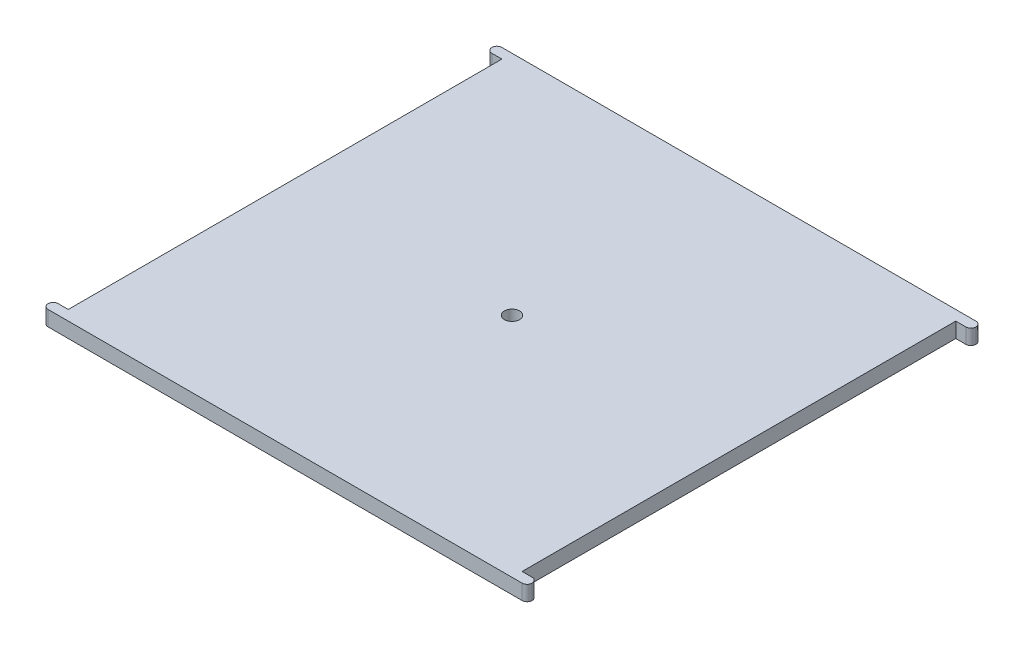
ISO-10303-21;
HEADER;
FILE_DESCRIPTION(('STEP AP214'),'2;1');
FILE_NAME('part.step','',(''),(''),'','','');
FILE_SCHEMA(('AUTOMOTIVE_DESIGN { 1 0 10303 214 1 1 1 1 }'));
ENDSEC;
DATA;
#1=APPLICATION_CONTEXT('core data for automotive mechanical design processes');
#2=APPLICATION_PROTOCOL_DEFINITION('international standard','automotive_design',2000,#1);
#3=PRODUCT_CONTEXT('',#1,'mechanical');
#4=PRODUCT('Part','Part','',(#3));
#5=PRODUCT_RELATED_PRODUCT_CATEGORY('part','',(#4));
#6=PRODUCT_DEFINITION_FORMATION('','',#4);
#7=PRODUCT_DEFINITION_CONTEXT('part definition',#1,'design');
#8=PRODUCT_DEFINITION('design','',#6,#7);
#9=PRODUCT_DEFINITION_SHAPE('','',#8);
#10=(LENGTH_UNIT() NAMED_UNIT(*) SI_UNIT(.MILLI.,.METRE.));
#11=(NAMED_UNIT(*) PLANE_ANGLE_UNIT() SI_UNIT($,.RADIAN.));
#12=(NAMED_UNIT(*) SI_UNIT($,.STERADIAN.) SOLID_ANGLE_UNIT());
#13=UNCERTAINTY_MEASURE_WITH_UNIT(LENGTH_MEASURE(1.E-05),#10,'distance_accuracy_value','');
#14=(GEOMETRIC_REPRESENTATION_CONTEXT(3) GLOBAL_UNCERTAINTY_ASSIGNED_CONTEXT((#13)) GLOBAL_UNIT_ASSIGNED_CONTEXT((#10,
#11,#12)) REPRESENTATION_CONTEXT('',''));
#15=CARTESIAN_POINT('',(0.,0.,0.));
#16=DIRECTION('',(0.,0.,1.));
#17=DIRECTION('',(1.,0.,0.));
#18=AXIS2_PLACEMENT_3D('',#15,#16,#17);
#19=CARTESIAN_POINT('',(-71.4375,4.7625,-71.4375));
#20=DIRECTION('',(0.,0.,1.));
#21=DIRECTION('',(1.,0.,0.));
#22=AXIS2_PLACEMENT_3D('',#19,#20,#21);
#23=PLANE('',#22);
#24=DIRECTION('',(-1.,0.,0.));
#25=VECTOR('',#24,1.);
#26=CARTESIAN_POINT('',(71.4375,4.7625,-71.4375));
#27=LINE('',#26,#25);
#28=CARTESIAN_POINT('',(74.6125,4.7625,-71.4375));
#29=VERTEX_POINT('',#28);
#30=CARTESIAN_POINT('',(-74.6125,4.7625,-71.4375));
#31=VERTEX_POINT('',#30);
#32=EDGE_CURVE('E157',#29,#31,#27,.T.);
#33=ORIENTED_EDGE('',*,*,#32,.F.);
#34=DIRECTION('',(0.,-1.,0.));
#35=VECTOR('',#34,1.);
#36=CARTESIAN_POINT('',(74.6125,4.7625,-71.4375));
#37=LINE('',#36,#35);
#38=CARTESIAN_POINT('',(74.6125,0.,-71.4375));
#39=VERTEX_POINT('',#38);
#40=EDGE_CURVE('E42',#29,#39,#37,.T.);
#41=ORIENTED_EDGE('',*,*,#40,.T.);
#42=DIRECTION('',(-1.,0.,0.));
#43=VECTOR('',#42,1.);
#44=CARTESIAN_POINT('',(-71.4375,0.,-71.4375));
#45=LINE('',#44,#43);
#46=CARTESIAN_POINT('',(-74.6125,0.,-71.4375));
#47=VERTEX_POINT('',#46);
#48=EDGE_CURVE('E187',#39,#47,#45,.T.);
#49=ORIENTED_EDGE('',*,*,#48,.T.);
#50=DIRECTION('',(0.,-1.,0.));
#51=VECTOR('',#50,1.);
#52=CARTESIAN_POINT('',(-74.6125,4.7625,-71.4375));
#53=LINE('',#52,#51);
#54=EDGE_CURVE('E254',#47,#31,#53,.F.);
#55=ORIENTED_EDGE('',*,*,#54,.T.);
#56=EDGE_LOOP('',(#33,#41,#49,#55));
#57=FACE_BOUND('',#56,.T.);
#58=ADVANCED_FACE('F33',(#57),#23,.F.);
#59=CARTESIAN_POINT('',(-71.4375,4.7625,-68.2625));
#60=DIRECTION('',(0.,0.,-1.));
#61=DIRECTION('',(-1.,0.,0.));
#62=AXIS2_PLACEMENT_3D('',#59,#60,#61);
#63=PLANE('',#62);
#64=DIRECTION('',(1.,0.,0.));
#65=VECTOR('',#64,1.);
#66=CARTESIAN_POINT('',(-71.4375,4.7625,-68.2625));
#67=LINE('',#66,#65);
#68=CARTESIAN_POINT('',(-74.6125,4.7625,-68.2625));
#69=VERTEX_POINT('',#68);
#70=CARTESIAN_POINT('',(-71.4375,4.7625,-68.2625));
#71=VERTEX_POINT('',#70);
#72=EDGE_CURVE('E146',#69,#71,#67,.T.);
#73=ORIENTED_EDGE('',*,*,#72,.F.);
#74=DIRECTION('',(0.,-1.,0.));
#75=VECTOR('',#74,1.);
#76=CARTESIAN_POINT('',(-74.6125,4.7625,-68.2625));
#77=LINE('',#76,#75);
#78=CARTESIAN_POINT('',(-74.6125,0.,-68.2625));
#79=VERTEX_POINT('',#78);
#80=EDGE_CURVE('E11',#69,#79,#77,.T.);
#81=ORIENTED_EDGE('',*,*,#80,.T.);
#82=DIRECTION('',(1.,0.,0.));
#83=VECTOR('',#82,1.);
#84=CARTESIAN_POINT('',(-71.4375,0.,-68.2625));
#85=LINE('',#84,#83);
#86=CARTESIAN_POINT('',(-71.4375,0.,-68.2625));
#87=VERTEX_POINT('',#86);
#88=EDGE_CURVE('E163',#79,#87,#85,.T.);
#89=ORIENTED_EDGE('',*,*,#88,.T.);
#90=DIRECTION('',(0.,-1.,0.));
#91=VECTOR('',#90,1.);
#92=CARTESIAN_POINT('',(-71.4375,4.7625,-68.2625));
#93=LINE('',#92,#91);
#94=EDGE_CURVE('E160',#71,#87,#93,.T.);
#95=ORIENTED_EDGE('',*,*,#94,.F.);
#96=EDGE_LOOP('',(#73,#81,#89,#95));
#97=FACE_BOUND('',#96,.T.);
#98=ADVANCED_FACE('F161',(#97),#63,.F.);
#99=CARTESIAN_POINT('',(-71.4375,4.7625,68.2625));
#100=DIRECTION('',(1.,0.,0.));
#101=DIRECTION('',(0.,0.,-1.));
#102=AXIS2_PLACEMENT_3D('',#99,#100,#101);
#103=PLANE('',#102);
#104=DIRECTION('',(0.,0.,1.));
#105=VECTOR('',#104,1.);
#106=CARTESIAN_POINT('',(-71.4375,0.,68.2625));
#107=LINE('',#106,#105);
#108=CARTESIAN_POINT('',(-71.4375,0.,68.2625));
#109=VERTEX_POINT('',#108);
#110=EDGE_CURVE('E192',#87,#109,#107,.T.);
#111=ORIENTED_EDGE('',*,*,#110,.T.);
#112=DIRECTION('',(0.,-1.,0.));
#113=VECTOR('',#112,1.);
#114=CARTESIAN_POINT('',(-71.4375,4.7625,68.2625));
#115=LINE('',#114,#113);
#116=CARTESIAN_POINT('',(-71.4375,4.7625,68.2625));
#117=VERTEX_POINT('',#116);
#118=EDGE_CURVE('E167',#117,#109,#115,.T.);
#119=ORIENTED_EDGE('',*,*,#118,.F.);
#120=DIRECTION('',(0.,0.,1.));
#121=VECTOR('',#120,1.);
#122=CARTESIAN_POINT('',(-71.4375,4.7625,68.2625));
#123=LINE('',#122,#121);
#124=EDGE_CURVE('E151',#71,#117,#123,.T.);
#125=ORIENTED_EDGE('',*,*,#124,.F.);
#126=ORIENTED_EDGE('',*,*,#94,.T.);
#127=EDGE_LOOP('',(#111,#119,#125,#126));
#128=FACE_BOUND('',#127,.T.);
#129=ADVANCED_FACE('F169',(#128),#103,.F.);
#130=CARTESIAN_POINT('',(-71.4375,4.7625,68.2625));
#131=DIRECTION('',(0.,0.,1.));
#132=DIRECTION('',(1.,0.,0.));
#133=AXIS2_PLACEMENT_3D('',#130,#131,#132);
#134=PLANE('',#133);
#135=DIRECTION('',(-1.,0.,0.));
#136=VECTOR('',#135,1.);
#137=CARTESIAN_POINT('',(-71.4375,0.,68.2625));
#138=LINE('',#137,#136);
#139=CARTESIAN_POINT('',(-74.6125,0.,68.2625));
#140=VERTEX_POINT('',#139);
#141=EDGE_CURVE('E194',#109,#140,#138,.T.);
#142=ORIENTED_EDGE('',*,*,#141,.T.);
#143=DIRECTION('',(0.,-1.,0.));
#144=VECTOR('',#143,1.);
#145=CARTESIAN_POINT('',(-74.6125,4.7625,68.2625));
#146=LINE('',#145,#144);
#147=CARTESIAN_POINT('',(-74.6125,4.7625,68.2625));
#148=VERTEX_POINT('',#147);
#149=EDGE_CURVE('E248',#140,#148,#146,.F.);
#150=ORIENTED_EDGE('',*,*,#149,.T.);
#151=DIRECTION('',(-1.,0.,0.));
#152=VECTOR('',#151,1.);
#153=CARTESIAN_POINT('',(-71.4375,4.7625,68.2625));
#154=LINE('',#153,#152);
#155=EDGE_CURVE('E172',#117,#148,#154,.T.);
#156=ORIENTED_EDGE('',*,*,#155,.F.);
#157=ORIENTED_EDGE('',*,*,#118,.T.);
#158=EDGE_LOOP('',(#142,#150,#156,#157));
#159=FACE_BOUND('',#158,.T.);
#160=ADVANCED_FACE('F350',(#159),#134,.F.);
#161=CARTESIAN_POINT('',(71.4375,4.7625,71.4375));
#162=DIRECTION('',(0.,0.,-1.));
#163=DIRECTION('',(-1.,0.,0.));
#164=AXIS2_PLACEMENT_3D('',#161,#162,#163);
#165=PLANE('',#164);
#166=DIRECTION('',(1.,0.,0.));
#167=VECTOR('',#166,1.);
#168=CARTESIAN_POINT('',(-71.4375,4.7625,71.4375));
#169=LINE('',#168,#167);
#170=CARTESIAN_POINT('',(-74.6125,4.7625,71.4375));
#171=VERTEX_POINT('',#170);
#172=CARTESIAN_POINT('',(74.6125,4.7625,71.4375000000004));
#173=VERTEX_POINT('',#172);
#174=EDGE_CURVE('E174',#171,#173,#169,.T.);
#175=ORIENTED_EDGE('',*,*,#174,.F.);
#176=DIRECTION('',(0.,-1.,0.));
#177=VECTOR('',#176,1.);
#178=CARTESIAN_POINT('',(-74.6125,4.7625,71.4375000000004));
#179=LINE('',#178,#177);
#180=CARTESIAN_POINT('',(-74.6125,0.,71.4375000000004));
#181=VERTEX_POINT('',#180);
#182=EDGE_CURVE('E215',#171,#181,#179,.T.);
#183=ORIENTED_EDGE('',*,*,#182,.T.);
#184=DIRECTION('',(1.,0.,0.));
#185=VECTOR('',#184,1.);
#186=CARTESIAN_POINT('',(71.4375,0.,71.4375));
#187=LINE('',#186,#185);
#188=CARTESIAN_POINT('',(74.6125,0.,71.4375));
#189=VERTEX_POINT('',#188);
#190=EDGE_CURVE('E197',#181,#189,#187,.T.);
#191=ORIENTED_EDGE('',*,*,#190,.T.);
#192=DIRECTION('',(0.,-1.,0.));
#193=VECTOR('',#192,1.);
#194=CARTESIAN_POINT('',(74.6125,4.7625,71.4375));
#195=LINE('',#194,#193);
#196=EDGE_CURVE('E166',#189,#173,#195,.F.);
#197=ORIENTED_EDGE('',*,*,#196,.T.);
#198=EDGE_LOOP('',(#175,#183,#191,#197));
#199=FACE_BOUND('',#198,.T.);
#200=ADVANCED_FACE('F341',(#199),#165,.F.);
#201=CARTESIAN_POINT('',(71.4375,4.7625,68.2625));
#202=DIRECTION('',(0.,0.,1.));
#203=DIRECTION('',(1.,0.,0.));
#204=AXIS2_PLACEMENT_3D('',#201,#202,#203);
#205=PLANE('',#204);
#206=DIRECTION('',(-1.,0.,0.));
#207=VECTOR('',#206,1.);
#208=CARTESIAN_POINT('',(71.4375,4.7625,68.2625));
#209=LINE('',#208,#207);
#210=CARTESIAN_POINT('',(74.6125,4.7625,68.2625));
#211=VERTEX_POINT('',#210);
#212=CARTESIAN_POINT('',(71.4375,4.7625,68.2625));
#213=VERTEX_POINT('',#212);
#214=EDGE_CURVE('E180',#211,#213,#209,.T.);
#215=ORIENTED_EDGE('',*,*,#214,.F.);
#216=DIRECTION('',(0.,-1.,0.));
#217=VECTOR('',#216,1.);
#218=CARTESIAN_POINT('',(74.6125,4.7625,68.2625));
#219=LINE('',#218,#217);
#220=CARTESIAN_POINT('',(74.6125,0.,68.2625));
#221=VERTEX_POINT('',#220);
#222=EDGE_CURVE('E250',#211,#221,#219,.T.);
#223=ORIENTED_EDGE('',*,*,#222,.T.);
#224=DIRECTION('',(-1.,0.,0.));
#225=VECTOR('',#224,1.);
#226=CARTESIAN_POINT('',(71.4375,0.,68.2625));
#227=LINE('',#226,#225);
#228=CARTESIAN_POINT('',(71.4375,0.,68.2625));
#229=VERTEX_POINT('',#228);
#230=EDGE_CURVE('E200',#221,#229,#227,.T.);
#231=ORIENTED_EDGE('',*,*,#230,.T.);
#232=DIRECTION('',(0.,-1.,0.));
#233=VECTOR('',#232,1.);
#234=CARTESIAN_POINT('',(71.4375,4.7625,68.2625));
#235=LINE('',#234,#233);
#236=EDGE_CURVE('E209',#213,#229,#235,.T.);
#237=ORIENTED_EDGE('',*,*,#236,.F.);
#238=EDGE_LOOP('',(#215,#223,#231,#237));
#239=FACE_BOUND('',#238,.T.);
#240=ADVANCED_FACE('F332',(#239),#205,.F.);
#241=CARTESIAN_POINT('',(71.4375,4.7625,68.2625));
#242=DIRECTION('',(-1.,0.,0.));
#243=DIRECTION('',(0.,0.,1.));
#244=AXIS2_PLACEMENT_3D('',#241,#242,#243);
#245=PLANE('',#244);
#246=DIRECTION('',(0.,0.,-1.));
#247=VECTOR('',#246,1.);
#248=CARTESIAN_POINT('',(71.4375,0.,68.2625));
#249=LINE('',#248,#247);
#250=CARTESIAN_POINT('',(71.4375,0.,-68.2625));
#251=VERTEX_POINT('',#250);
#252=EDGE_CURVE('E202',#229,#251,#249,.T.);
#253=ORIENTED_EDGE('',*,*,#252,.T.);
#254=DIRECTION('',(0.,-1.,0.));
#255=VECTOR('',#254,1.);
#256=CARTESIAN_POINT('',(71.4375,4.7625,-68.2625));
#257=LINE('',#256,#255);
#258=CARTESIAN_POINT('',(71.4375,4.7625,-68.2625));
#259=VERTEX_POINT('',#258);
#260=EDGE_CURVE('E186',#259,#251,#257,.T.);
#261=ORIENTED_EDGE('',*,*,#260,.F.);
#262=DIRECTION('',(0.,0.,-1.));
#263=VECTOR('',#262,1.);
#264=CARTESIAN_POINT('',(71.4375,4.7625,68.2625));
#265=LINE('',#264,#263);
#266=EDGE_CURVE('E182',#213,#259,#265,.T.);
#267=ORIENTED_EDGE('',*,*,#266,.F.);
#268=ORIENTED_EDGE('',*,*,#236,.T.);
#269=EDGE_LOOP('',(#253,#261,#267,#268));
#270=FACE_BOUND('',#269,.T.);
#271=ADVANCED_FACE('F335',(#270),#245,.F.);
#272=CARTESIAN_POINT('',(71.4375,4.7625,-68.2625));
#273=DIRECTION('',(0.,0.,-1.));
#274=DIRECTION('',(-1.,0.,0.));
#275=AXIS2_PLACEMENT_3D('',#272,#273,#274);
#276=PLANE('',#275);
#277=DIRECTION('',(1.,0.,0.));
#278=VECTOR('',#277,1.);
#279=CARTESIAN_POINT('',(71.4375,0.,-68.2625));
#280=LINE('',#279,#278);
#281=CARTESIAN_POINT('',(74.6125,0.,-68.2625));
#282=VERTEX_POINT('',#281);
#283=EDGE_CURVE('E204',#251,#282,#280,.T.);
#284=ORIENTED_EDGE('',*,*,#283,.T.);
#285=DIRECTION('',(0.,-1.,0.));
#286=VECTOR('',#285,1.);
#287=CARTESIAN_POINT('',(74.6125,4.7625,-68.2625));
#288=LINE('',#287,#286);
#289=CARTESIAN_POINT('',(74.6125,4.7625,-68.2625));
#290=VERTEX_POINT('',#289);
#291=EDGE_CURVE('E252',#282,#290,#288,.F.);
#292=ORIENTED_EDGE('',*,*,#291,.T.);
#293=DIRECTION('',(1.,0.,0.));
#294=VECTOR('',#293,1.);
#295=CARTESIAN_POINT('',(71.4375,4.7625,-68.2625));
#296=LINE('',#295,#294);
#297=EDGE_CURVE('E184',#259,#290,#296,.T.);
#298=ORIENTED_EDGE('',*,*,#297,.F.);
#299=ORIENTED_EDGE('',*,*,#260,.T.);
#300=EDGE_LOOP('',(#284,#292,#298,#299));
#301=FACE_BOUND('',#300,.T.);
#302=ADVANCED_FACE('F288',(#301),#276,.F.);
#303=CARTESIAN_POINT('',(0.,4.7625,0.));
#304=DIRECTION('',(0.,-1.,0.));
#305=DIRECTION('',(0.,0.,-1.));
#306=AXIS2_PLACEMENT_3D('',#303,#304,#305);
#307=PLANE('',#306);
#308=CARTESIAN_POINT('',(0.,4.7625,0.));
#309=DIRECTION('',(0.,1.,0.));
#310=DIRECTION('',(0.,0.,1.));
#311=AXIS2_PLACEMENT_3D('',#308,#309,#310);
#312=CIRCLE('',#311,2.38124999999999);
#313=CARTESIAN_POINT('',(0.,4.7625,2.38124999999999));
#314=VERTEX_POINT('',#313);
#315=EDGE_CURVE('E260',#314,#314,#312,.T.);
#316=ORIENTED_EDGE('',*,*,#315,.F.);
#317=EDGE_LOOP('',(#316));
#318=FACE_BOUND('',#317,.T.);
#319=CARTESIAN_POINT('',(-74.6125,4.7625,69.85));
#320=DIRECTION('',(0.,-1.,0.));
#321=DIRECTION('',(0.,0.,-1.));
#322=AXIS2_PLACEMENT_3D('',#319,#320,#321);
#323=CIRCLE('',#322,1.5875);
#324=CARTESIAN_POINT('',(-76.2,4.7625,69.85));
#325=VERTEX_POINT('',#324);
#326=EDGE_CURVE('E244',#148,#325,#323,.F.);
#327=ORIENTED_EDGE('',*,*,#326,.T.);
#328=CARTESIAN_POINT('',(-74.6125,4.7625,69.8500000000004));
#329=DIRECTION('',(0.,-1.,0.));
#330=DIRECTION('',(0.,0.,-1.));
#331=AXIS2_PLACEMENT_3D('',#328,#329,#330);
#332=CIRCLE('',#331,1.5875);
#333=EDGE_CURVE('E246',#325,#171,#332,.F.);
#334=ORIENTED_EDGE('',*,*,#333,.T.);
#335=ORIENTED_EDGE('',*,*,#174,.T.);
#336=CARTESIAN_POINT('',(74.6125,4.7625,69.85));
#337=DIRECTION('',(0.,-1.,0.));
#338=DIRECTION('',(0.,0.,-1.));
#339=AXIS2_PLACEMENT_3D('',#336,#337,#338);
#340=CIRCLE('',#339,1.5875);
#341=CARTESIAN_POINT('',(76.2,4.7625,69.85));
#342=VERTEX_POINT('',#341);
#343=EDGE_CURVE('E242',#173,#342,#340,.F.);
#344=ORIENTED_EDGE('',*,*,#343,.T.);
#345=CARTESIAN_POINT('',(74.6125,4.7625,69.85));
#346=DIRECTION('',(0.,-1.,0.));
#347=DIRECTION('',(0.,0.,-1.));
#348=AXIS2_PLACEMENT_3D('',#345,#346,#347);
#349=CIRCLE('',#348,1.5875);
#350=EDGE_CURVE('E240',#342,#211,#349,.F.);
#351=ORIENTED_EDGE('',*,*,#350,.T.);
#352=ORIENTED_EDGE('',*,*,#214,.T.);
#353=ORIENTED_EDGE('',*,*,#266,.T.);
#354=ORIENTED_EDGE('',*,*,#297,.T.);
#355=CARTESIAN_POINT('',(74.6125,4.7625,-69.85));
#356=DIRECTION('',(0.,-1.,0.));
#357=DIRECTION('',(0.,0.,-1.));
#358=AXIS2_PLACEMENT_3D('',#355,#356,#357);
#359=CIRCLE('',#358,1.5875);
#360=CARTESIAN_POINT('',(76.2,4.7625,-69.85));
#361=VERTEX_POINT('',#360);
#362=EDGE_CURVE('E50',#290,#361,#359,.F.);
#363=ORIENTED_EDGE('',*,*,#362,.T.);
#364=CARTESIAN_POINT('',(74.6125,4.7625,-69.85));
#365=DIRECTION('',(0.,-1.,0.));
#366=DIRECTION('',(0.,0.,-1.));
#367=AXIS2_PLACEMENT_3D('',#364,#365,#366);
#368=CIRCLE('',#367,1.5875);
#369=EDGE_CURVE('E237',#361,#29,#368,.F.);
#370=ORIENTED_EDGE('',*,*,#369,.T.);
#371=ORIENTED_EDGE('',*,*,#32,.T.);
#372=CARTESIAN_POINT('',(-74.6125,4.7625,-69.85));
#373=DIRECTION('',(0.,-1.,0.));
#374=DIRECTION('',(0.,0.,-1.));
#375=AXIS2_PLACEMENT_3D('',#372,#373,#374);
#376=CIRCLE('',#375,1.5875);
#377=CARTESIAN_POINT('',(-76.2,4.7625,-69.85));
#378=VERTEX_POINT('',#377);
#379=EDGE_CURVE('E234',#31,#378,#376,.F.);
#380=ORIENTED_EDGE('',*,*,#379,.T.);
#381=CARTESIAN_POINT('',(-74.6125,4.7625,-69.85));
#382=DIRECTION('',(0.,-1.,0.));
#383=DIRECTION('',(0.,0.,-1.));
#384=AXIS2_PLACEMENT_3D('',#381,#382,#383);
#385=CIRCLE('',#384,1.5875);
#386=EDGE_CURVE('E154',#378,#69,#385,.F.);
#387=ORIENTED_EDGE('',*,*,#386,.T.);
#388=ORIENTED_EDGE('',*,*,#72,.T.);
#389=ORIENTED_EDGE('',*,*,#124,.T.);
#390=ORIENTED_EDGE('',*,*,#155,.T.);
#391=EDGE_LOOP('',(#327,#334,#335,#344,#351,#352,#353,#354,#363,#370,#371,#380,#387,#388,#389,#390));
#392=FACE_BOUND('',#391,.T.);
#393=ADVANCED_FACE('F148',(#318,#392),#307,.F.);
#394=CARTESIAN_POINT('',(0.,0.,0.));
#395=DIRECTION('',(0.,-1.,0.));
#396=DIRECTION('',(0.,0.,-1.));
#397=AXIS2_PLACEMENT_3D('',#394,#395,#396);
#398=PLANE('',#397);
#399=CARTESIAN_POINT('',(0.,0.,0.));
#400=DIRECTION('',(0.,1.,0.));
#401=DIRECTION('',(0.,0.,1.));
#402=AXIS2_PLACEMENT_3D('',#399,#400,#401);
#403=CIRCLE('',#402,2.38125);
#404=CARTESIAN_POINT('',(0.,0.,2.38125));
#405=VERTEX_POINT('',#404);
#406=EDGE_CURVE('E190',#405,#405,#403,.T.);
#407=ORIENTED_EDGE('',*,*,#406,.T.);
#408=EDGE_LOOP('',(#407));
#409=FACE_BOUND('',#408,.T.);
#410=ORIENTED_EDGE('',*,*,#190,.F.);
#411=CARTESIAN_POINT('',(-74.6125,0.,69.8500000000004));
#412=DIRECTION('',(0.,-1.,0.));
#413=DIRECTION('',(0.,0.,-1.));
#414=AXIS2_PLACEMENT_3D('',#411,#412,#413);
#415=CIRCLE('',#414,1.5875);
#416=CARTESIAN_POINT('',(-76.2,0.,69.85));
#417=VERTEX_POINT('',#416);
#418=EDGE_CURVE('E232',#181,#417,#415,.T.);
#419=ORIENTED_EDGE('',*,*,#418,.T.);
#420=CARTESIAN_POINT('',(-74.6125,0.,69.85));
#421=DIRECTION('',(0.,-1.,0.));
#422=DIRECTION('',(0.,0.,-1.));
#423=AXIS2_PLACEMENT_3D('',#420,#421,#422);
#424=CIRCLE('',#423,1.5875);
#425=EDGE_CURVE('E230',#417,#140,#424,.T.);
#426=ORIENTED_EDGE('',*,*,#425,.T.);
#427=ORIENTED_EDGE('',*,*,#141,.F.);
#428=ORIENTED_EDGE('',*,*,#110,.F.);
#429=ORIENTED_EDGE('',*,*,#88,.F.);
#430=CARTESIAN_POINT('',(-74.6125,0.,-69.85));
#431=DIRECTION('',(0.,-1.,0.));
#432=DIRECTION('',(0.,0.,-1.));
#433=AXIS2_PLACEMENT_3D('',#430,#431,#432);
#434=CIRCLE('',#433,1.5875);
#435=CARTESIAN_POINT('',(-76.2,0.,-69.85));
#436=VERTEX_POINT('',#435);
#437=EDGE_CURVE('E220',#79,#436,#434,.T.);
#438=ORIENTED_EDGE('',*,*,#437,.T.);
#439=CARTESIAN_POINT('',(-74.6125,0.,-69.85));
#440=DIRECTION('',(0.,-1.,0.));
#441=DIRECTION('',(0.,0.,-1.));
#442=AXIS2_PLACEMENT_3D('',#439,#440,#441);
#443=CIRCLE('',#442,1.5875);
#444=EDGE_CURVE('E218',#436,#47,#443,.T.);
#445=ORIENTED_EDGE('',*,*,#444,.T.);
#446=ORIENTED_EDGE('',*,*,#48,.F.);
#447=CARTESIAN_POINT('',(74.6125,0.,-69.85));
#448=DIRECTION('',(0.,-1.,0.));
#449=DIRECTION('',(0.,0.,-1.));
#450=AXIS2_PLACEMENT_3D('',#447,#448,#449);
#451=CIRCLE('',#450,1.5875);
#452=CARTESIAN_POINT('',(76.2,0.,-69.85));
#453=VERTEX_POINT('',#452);
#454=EDGE_CURVE('E222',#39,#453,#451,.T.);
#455=ORIENTED_EDGE('',*,*,#454,.T.);
#456=CARTESIAN_POINT('',(74.6125,0.,-69.85));
#457=DIRECTION('',(0.,-1.,0.));
#458=DIRECTION('',(0.,0.,-1.));
#459=AXIS2_PLACEMENT_3D('',#456,#457,#458);
#460=CIRCLE('',#459,1.5875);
#461=EDGE_CURVE('E224',#453,#282,#460,.T.);
#462=ORIENTED_EDGE('',*,*,#461,.T.);
#463=ORIENTED_EDGE('',*,*,#283,.F.);
#464=ORIENTED_EDGE('',*,*,#252,.F.);
#465=ORIENTED_EDGE('',*,*,#230,.F.);
#466=CARTESIAN_POINT('',(74.6125,0.,69.85));
#467=DIRECTION('',(0.,-1.,0.));
#468=DIRECTION('',(0.,0.,-1.));
#469=AXIS2_PLACEMENT_3D('',#466,#467,#468);
#470=CIRCLE('',#469,1.5875);
#471=CARTESIAN_POINT('',(76.2,0.,69.85));
#472=VERTEX_POINT('',#471);
#473=EDGE_CURVE('E226',#221,#472,#470,.T.);
#474=ORIENTED_EDGE('',*,*,#473,.T.);
#475=CARTESIAN_POINT('',(74.6125,0.,69.85));
#476=DIRECTION('',(0.,-1.,0.));
#477=DIRECTION('',(0.,0.,-1.));
#478=AXIS2_PLACEMENT_3D('',#475,#476,#477);
#479=CIRCLE('',#478,1.5875);
#480=EDGE_CURVE('E228',#472,#189,#479,.T.);
#481=ORIENTED_EDGE('',*,*,#480,.T.);
#482=EDGE_LOOP('',(#410,#419,#426,#427,#428,#429,#438,#445,#446,#455,#462,#463,#464,#465,#474,#481));
#483=FACE_BOUND('',#482,.T.);
#484=ADVANCED_FACE('F277',(#409,#483),#398,.T.);
#485=CARTESIAN_POINT('',(0.,4.7625,0.));
#486=DIRECTION('',(0.,1.,0.));
#487=DIRECTION('',(0.,0.,1.));
#488=AXIS2_PLACEMENT_3D('',#485,#486,#487);
#489=CYLINDRICAL_SURFACE('',#488,2.38124999999999);
#490=ORIENTED_EDGE('',*,*,#406,.F.);
#491=EDGE_LOOP('',(#490));
#492=FACE_BOUND('',#491,.T.);
#493=ORIENTED_EDGE('',*,*,#315,.T.);
#494=EDGE_LOOP('',(#493));
#495=FACE_BOUND('',#494,.T.);
#496=ADVANCED_FACE('F317',(#492,#495),#489,.F.);
#497=CARTESIAN_POINT('',(-74.6125,4.7625,69.85));
#498=DIRECTION('',(0.,-1.,0.));
#499=DIRECTION('',(0.,0.,-1.));
#500=AXIS2_PLACEMENT_3D('',#497,#498,#499);
#501=CYLINDRICAL_SURFACE('',#500,1.5875);
#502=DIRECTION('',(0.,-1.,0.));
#503=VECTOR('',#502,1.);
#504=CARTESIAN_POINT('',(-76.2,4.7625,69.85));
#505=LINE('',#504,#503);
#506=EDGE_CURVE('E257',#325,#417,#505,.T.);
#507=ORIENTED_EDGE('',*,*,#506,.F.);
#508=ORIENTED_EDGE('',*,*,#326,.F.);
#509=ORIENTED_EDGE('',*,*,#149,.F.);
#510=ORIENTED_EDGE('',*,*,#425,.F.);
#511=EDGE_LOOP('',(#507,#508,#509,#510));
#512=FACE_BOUND('',#511,.T.);
#513=ADVANCED_FACE('F313',(#512),#501,.T.);
#514=CARTESIAN_POINT('',(-74.6125,4.7625,69.8500000000004));
#515=DIRECTION('',(0.,-1.,0.));
#516=DIRECTION('',(0.,0.,-1.));
#517=AXIS2_PLACEMENT_3D('',#514,#515,#516);
#518=CYLINDRICAL_SURFACE('',#517,1.5875);
#519=ORIENTED_EDGE('',*,*,#333,.F.);
#520=ORIENTED_EDGE('',*,*,#506,.T.);
#521=ORIENTED_EDGE('',*,*,#418,.F.);
#522=ORIENTED_EDGE('',*,*,#182,.F.);
#523=EDGE_LOOP('',(#519,#520,#521,#522));
#524=FACE_BOUND('',#523,.T.);
#525=ADVANCED_FACE('F309',(#524),#518,.T.);
#526=CARTESIAN_POINT('',(74.6125,4.7625,69.85));
#527=DIRECTION('',(0.,-1.,0.));
#528=DIRECTION('',(0.,0.,-1.));
#529=AXIS2_PLACEMENT_3D('',#526,#527,#528);
#530=CYLINDRICAL_SURFACE('',#529,1.5875);
#531=ORIENTED_EDGE('',*,*,#222,.F.);
#532=ORIENTED_EDGE('',*,*,#350,.F.);
#533=DIRECTION('',(0.,-1.,0.));
#534=VECTOR('',#533,1.);
#535=CARTESIAN_POINT('',(76.2,4.7625,69.85));
#536=LINE('',#535,#534);
#537=EDGE_CURVE('E261',#472,#342,#536,.F.);
#538=ORIENTED_EDGE('',*,*,#537,.F.);
#539=ORIENTED_EDGE('',*,*,#473,.F.);
#540=EDGE_LOOP('',(#531,#532,#538,#539));
#541=FACE_BOUND('',#540,.T.);
#542=ADVANCED_FACE('F312',(#541),#530,.T.);
#543=CARTESIAN_POINT('',(74.6125,4.7625,69.85));
#544=DIRECTION('',(0.,-1.,0.));
#545=DIRECTION('',(0.,0.,-1.));
#546=AXIS2_PLACEMENT_3D('',#543,#544,#545);
#547=CYLINDRICAL_SURFACE('',#546,1.5875);
#548=ORIENTED_EDGE('',*,*,#343,.F.);
#549=ORIENTED_EDGE('',*,*,#196,.F.);
#550=ORIENTED_EDGE('',*,*,#480,.F.);
#551=ORIENTED_EDGE('',*,*,#537,.T.);
#552=EDGE_LOOP('',(#548,#549,#550,#551));
#553=FACE_BOUND('',#552,.T.);
#554=ADVANCED_FACE('F298',(#553),#547,.T.);
#555=CARTESIAN_POINT('',(74.6125,4.7625,-69.85));
#556=DIRECTION('',(0.,-1.,0.));
#557=DIRECTION('',(0.,0.,-1.));
#558=AXIS2_PLACEMENT_3D('',#555,#556,#557);
#559=CYLINDRICAL_SURFACE('',#558,1.5875);
#560=ORIENTED_EDGE('',*,*,#40,.F.);
#561=ORIENTED_EDGE('',*,*,#369,.F.);
#562=DIRECTION('',(0.,-1.,0.));
#563=VECTOR('',#562,1.);
#564=CARTESIAN_POINT('',(76.2,4.7625,-69.85));
#565=LINE('',#564,#563);
#566=EDGE_CURVE('E263',#453,#361,#565,.F.);
#567=ORIENTED_EDGE('',*,*,#566,.F.);
#568=ORIENTED_EDGE('',*,*,#454,.F.);
#569=EDGE_LOOP('',(#560,#561,#567,#568));
#570=FACE_BOUND('',#569,.T.);
#571=ADVANCED_FACE('F284',(#570),#559,.T.);
#572=CARTESIAN_POINT('',(74.6125,4.7625,-69.85));
#573=DIRECTION('',(0.,-1.,0.));
#574=DIRECTION('',(0.,0.,-1.));
#575=AXIS2_PLACEMENT_3D('',#572,#573,#574);
#576=CYLINDRICAL_SURFACE('',#575,1.5875);
#577=ORIENTED_EDGE('',*,*,#362,.F.);
#578=ORIENTED_EDGE('',*,*,#291,.F.);
#579=ORIENTED_EDGE('',*,*,#461,.F.);
#580=ORIENTED_EDGE('',*,*,#566,.T.);
#581=EDGE_LOOP('',(#577,#578,#579,#580));
#582=FACE_BOUND('',#581,.T.);
#583=ADVANCED_FACE('F291',(#582),#576,.T.);
#584=CARTESIAN_POINT('',(-74.6125,4.7625,-69.85));
#585=DIRECTION('',(0.,-1.,0.));
#586=DIRECTION('',(0.,0.,-1.));
#587=AXIS2_PLACEMENT_3D('',#584,#585,#586);
#588=CYLINDRICAL_SURFACE('',#587,1.5875);
#589=DIRECTION('',(0.,-1.,0.));
#590=VECTOR('',#589,1.);
#591=CARTESIAN_POINT('',(-76.2,4.7625,-69.85));
#592=LINE('',#591,#590);
#593=EDGE_CURVE('E37',#378,#436,#592,.T.);
#594=ORIENTED_EDGE('',*,*,#593,.F.);
#595=ORIENTED_EDGE('',*,*,#379,.F.);
#596=ORIENTED_EDGE('',*,*,#54,.F.);
#597=ORIENTED_EDGE('',*,*,#444,.F.);
#598=EDGE_LOOP('',(#594,#595,#596,#597));
#599=FACE_BOUND('',#598,.T.);
#600=ADVANCED_FACE('F35',(#599),#588,.T.);
#601=CARTESIAN_POINT('',(-74.6125,4.7625,-69.85));
#602=DIRECTION('',(0.,-1.,0.));
#603=DIRECTION('',(0.,0.,-1.));
#604=AXIS2_PLACEMENT_3D('',#601,#602,#603);
#605=CYLINDRICAL_SURFACE('',#604,1.5875);
#606=ORIENTED_EDGE('',*,*,#386,.F.);
#607=ORIENTED_EDGE('',*,*,#593,.T.);
#608=ORIENTED_EDGE('',*,*,#437,.F.);
#609=ORIENTED_EDGE('',*,*,#80,.F.);
#610=EDGE_LOOP('',(#606,#607,#608,#609));
#611=FACE_BOUND('',#610,.T.);
#612=ADVANCED_FACE('F269',(#611),#605,.T.);
#613=CLOSED_SHELL('',(#58,#98,#129,#160,#200,#240,#271,#302,#393,#484,#496,#513,#525,#542,#554,
#571,#583,#600,#612));
#614=MANIFOLD_SOLID_BREP('B2',#613);
#615=ADVANCED_BREP_SHAPE_REPRESENTATION('',(#18,#614),#14);
#616=SHAPE_DEFINITION_REPRESENTATION(#9,#615);
ENDSEC;
END-ISO-10303-21;
